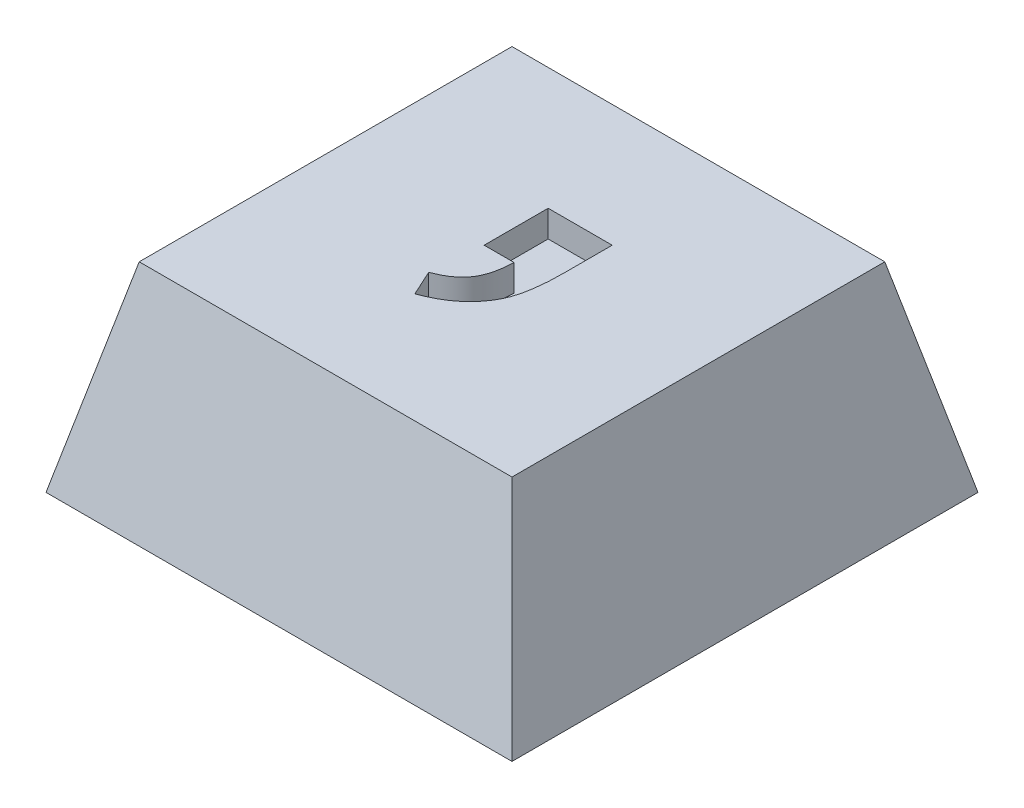
ISO-10303-21;
HEADER;
FILE_DESCRIPTION(('STEP AP214'),'2;1');
FILE_NAME('part.step','',(''),(''),'','','');
FILE_SCHEMA(('AUTOMOTIVE_DESIGN { 1 0 10303 214 1 1 1 1 }'));
ENDSEC;
DATA;
#1=APPLICATION_CONTEXT('core data for automotive mechanical design processes');
#2=APPLICATION_PROTOCOL_DEFINITION('international standard','automotive_design',2000,#1);
#3=PRODUCT_CONTEXT('',#1,'mechanical');
#4=PRODUCT('Part','Part','',(#3));
#5=PRODUCT_RELATED_PRODUCT_CATEGORY('part','',(#4));
#6=PRODUCT_DEFINITION_FORMATION('','',#4);
#7=PRODUCT_DEFINITION_CONTEXT('part definition',#1,'design');
#8=PRODUCT_DEFINITION('design','',#6,#7);
#9=PRODUCT_DEFINITION_SHAPE('','',#8);
#10=(LENGTH_UNIT() NAMED_UNIT(*) SI_UNIT(.MILLI.,.METRE.));
#11=(NAMED_UNIT(*) PLANE_ANGLE_UNIT() SI_UNIT($,.RADIAN.));
#12=(NAMED_UNIT(*) SI_UNIT($,.STERADIAN.) SOLID_ANGLE_UNIT());
#13=UNCERTAINTY_MEASURE_WITH_UNIT(LENGTH_MEASURE(1.E-05),#10,'distance_accuracy_value','');
#14=(GEOMETRIC_REPRESENTATION_CONTEXT(3) GLOBAL_UNCERTAINTY_ASSIGNED_CONTEXT((#13)) GLOBAL_UNIT_ASSIGNED_CONTEXT((#10,
#11,#12)) REPRESENTATION_CONTEXT('',''));
#15=CARTESIAN_POINT('',(0.,0.,0.));
#16=DIRECTION('',(0.,0.,1.));
#17=DIRECTION('',(1.,0.,0.));
#18=AXIS2_PLACEMENT_3D('',#15,#16,#17);
#19=CARTESIAN_POINT('',(0.,3.,0.));
#20=DIRECTION('',(0.,-1.,0.));
#21=DIRECTION('',(0.,0.,-1.));
#22=AXIS2_PLACEMENT_3D('',#19,#20,#21);
#23=PLANE('',#22);
#24=DIRECTION('',(-1.,0.,0.));
#25=VECTOR('',#24,1.);
#26=CARTESIAN_POINT('',(11.,3.,-0.7));
#27=LINE('',#26,#25);
#28=CARTESIAN_POINT('',(6.3,3.,-0.7));
#29=VERTEX_POINT('',#28);
#30=CARTESIAN_POINT('',(0.7,3.,-0.7));
#31=VERTEX_POINT('',#30);
#32=EDGE_CURVE('E65',#29,#31,#27,.T.);
#33=ORIENTED_EDGE('',*,*,#32,.F.);
#34=DIRECTION('',(0.,0.,1.));
#35=VECTOR('',#34,1.);
#36=CARTESIAN_POINT('',(6.3,3.,-7.));
#37=LINE('',#36,#35);
#38=CARTESIAN_POINT('',(6.3,3.,-6.3));
#39=VERTEX_POINT('',#38);
#40=EDGE_CURVE('E176',#39,#29,#37,.T.);
#41=ORIENTED_EDGE('',*,*,#40,.F.);
#42=DIRECTION('',(-1.,0.,0.));
#43=VECTOR('',#42,1.);
#44=CARTESIAN_POINT('',(11.,3.,-6.3));
#45=LINE('',#44,#43);
#46=CARTESIAN_POINT('',(0.699999999999998,3.,-6.3));
#47=VERTEX_POINT('',#46);
#48=EDGE_CURVE('E163',#39,#47,#45,.T.);
#49=ORIENTED_EDGE('',*,*,#48,.T.);
#50=DIRECTION('',(0.,0.,1.));
#51=VECTOR('',#50,1.);
#52=CARTESIAN_POINT('',(0.7,3.,-7.));
#53=LINE('',#52,#51);
#54=EDGE_CURVE('E177',#47,#31,#53,.T.);
#55=ORIENTED_EDGE('',*,*,#54,.T.);
#56=EDGE_LOOP('',(#33,#41,#49,#55));
#57=FACE_BOUND('',#56,.T.);
#58=DIRECTION('',(0.,0.,-1.));
#59=VECTOR('',#58,1.);
#60=CARTESIAN_POINT('',(3.07499201230395,3.,-3.50674696762963));
#61=LINE('',#60,#59);
#62=CARTESIAN_POINT('',(3.07499201230395,3.,-3.50674696762963));
#63=VERTEX_POINT('',#62);
#64=CARTESIAN_POINT('',(3.07499201230395,3.,-4.46828542916809));
#65=VERTEX_POINT('',#64);
#66=EDGE_CURVE('E58',#63,#65,#61,.T.);
#67=ORIENTED_EDGE('',*,*,#66,.T.);
#68=DIRECTION('',(1.,0.,0.));
#69=VECTOR('',#68,1.);
#70=CARTESIAN_POINT('',(3.07499201230395,3.,-4.46828542916809));
#71=LINE('',#70,#69);
#72=CARTESIAN_POINT('',(4.03653047384241,3.,-4.46828542916809));
#73=VERTEX_POINT('',#72);
#74=EDGE_CURVE('E147',#65,#73,#71,.T.);
#75=ORIENTED_EDGE('',*,*,#74,.T.);
#76=DIRECTION('',(0.,0.,1.));
#77=VECTOR('',#76,1.);
#78=CARTESIAN_POINT('',(4.03653047384241,3.,-4.46828542916809));
#79=LINE('',#78,#77);
#80=CARTESIAN_POINT('',(4.03653047384241,3.,-3.7691668394245));
#81=VERTEX_POINT('',#80);
#82=EDGE_CURVE('E434',#73,#81,#79,.T.);
#83=ORIENTED_EDGE('',*,*,#82,.T.);
#84=CARTESIAN_POINT('',(4.03653047384241,3.,-3.7691668394245));
#85=CARTESIAN_POINT('',(4.03608685146685,3.,-3.70202261305317));
#86=CARTESIAN_POINT('',(4.03524923422569,3.,-3.57524550542407));
#87=CARTESIAN_POINT('',(4.02056676372273,3.,-3.39640897964422));
#88=CARTESIAN_POINT('',(4.00016560527798,3.,-3.2393598768458));
#89=CARTESIAN_POINT('',(3.96771039123562,3.,-3.10207951934221));
#90=CARTESIAN_POINT('',(3.92425601942976,3.,-2.97810398571551));
#91=CARTESIAN_POINT('',(3.86281855154148,3.,-2.86466217175617));
#92=CARTESIAN_POINT('',(3.78726222228475,3.,-2.75610232316483));
#93=CARTESIAN_POINT('',(3.69484437591432,3.,-2.65570934866463));
#94=CARTESIAN_POINT('',(3.58853038431026,3.,-2.5628559291187));
#95=CARTESIAN_POINT('',(3.4670883338375,3.,-2.48210984664679));
#96=CARTESIAN_POINT('',(3.33340022947303,3.,-2.41016907352859));
#97=CARTESIAN_POINT('',(3.23735570534598,3.,-2.37229527644735));
#98=CARTESIAN_POINT('',(3.18817310204754,3.,-2.35290081378347));
#99=B_SPLINE_CURVE_WITH_KNOTS('',3,(#84,#85,#86,#87,#88,#89,#90,#91,#92,#93,#94,#95,#96,#97,
#98),.UNSPECIFIED.,.F.,.F.,(4,1,1,1,1,1,1,1,1,1,1,1,4),(0.,0.11226306929848,0.211967401940366,
0.29994169044828,0.376872974033872,0.447529216959618,0.518973247744178,0.591939579442453,
0.668229800220916,0.746606683184937,0.827453118097728,0.911641971053369,1.),.UNSPECIFIED.);
#100=CARTESIAN_POINT('',(3.18817310204754,3.,-2.35290081378347));
#101=VERTEX_POINT('',#100);
#102=EDGE_CURVE('E429',#81,#101,#99,.T.);
#103=ORIENTED_EDGE('',*,*,#102,.T.);
#104=DIRECTION('',(-0.418608195745654,0.,-0.908166933143113));
#105=VECTOR('',#104,1.);
#106=CARTESIAN_POINT('',(3.18817310204754,3.,-2.35290081378347));
#107=LINE('',#106,#105);
#108=CARTESIAN_POINT('',(3.01088944820138,3.,-2.73751619839886));
#109=VERTEX_POINT('',#108);
#110=EDGE_CURVE('E419',#101,#109,#107,.T.);
#111=ORIENTED_EDGE('',*,*,#110,.T.);
#112=CARTESIAN_POINT('',(3.01088944820138,3.,-2.73751619839886));
#113=CARTESIAN_POINT('',(3.05377782825176,3.,-2.75515401751433));
#114=CARTESIAN_POINT('',(3.13561584566161,3.,-2.78880985030979));
#115=CARTESIAN_POINT('',(3.24531696745308,3.,-2.85364309401779));
#116=CARTESIAN_POINT('',(3.33406253579716,3.,-2.92993599789845));
#117=CARTESIAN_POINT('',(3.40541672281135,3.,-3.01639957597613));
#118=CARTESIAN_POINT('',(3.45643151041404,3.,-3.11810713720647));
#119=CARTESIAN_POINT('',(3.49477007921536,3.,-3.23334111875122));
#120=CARTESIAN_POINT('',(3.51699424771997,3.,-3.36504918162714));
#121=CARTESIAN_POINT('',(3.52139589402638,3.,-3.45792145123487));
#122=CARTESIAN_POINT('',(3.5237099610219,3.,-3.50674696762963));
#123=B_SPLINE_CURVE_WITH_KNOTS('',3,(#112,#113,#114,#115,#116,#117,#118,#119,#120,#121,#122),
.UNSPECIFIED.,.F.,.F.,(4,1,1,1,1,1,1,1,4),(0.,0.139244977144443,0.26570210510156,
0.380936804013601,0.489358564032474,0.600190245832484,0.720743413981992,0.853187102279749,1.),.UNSPECIFIED.);
#124=CARTESIAN_POINT('',(3.5237099610219,3.,-3.50674696762963));
#125=VERTEX_POINT('',#124);
#126=EDGE_CURVE('E428',#109,#125,#123,.T.);
#127=ORIENTED_EDGE('',*,*,#126,.T.);
#128=DIRECTION('',(-1.,0.,0.));
#129=VECTOR('',#128,1.);
#130=CARTESIAN_POINT('',(3.5237099610219,3.,-3.50674696762963));
#131=LINE('',#130,#129);
#132=EDGE_CURVE('E143',#125,#63,#131,.T.);
#133=ORIENTED_EDGE('',*,*,#132,.T.);
#134=EDGE_LOOP('',(#67,#75,#83,#103,#111,#127,#133));
#135=FACE_BOUND('',#134,.T.);
#136=ADVANCED_FACE('F42',(#57,#135),#23,.F.);
#137=CARTESIAN_POINT('',(7.,0.,-7.));
#138=DIRECTION('',(-0.973841209741793,-0.227229615606418,0.));
#139=DIRECTION('',(0.227229615606418,-0.973841209741793,0.));
#140=AXIS2_PLACEMENT_3D('',#137,#138,#139);
#141=PLANE('',#140);
#142=DIRECTION('',(-0.221581128241521,0.949633406749377,-0.221581128241521));
#143=VECTOR('',#142,1.);
#144=CARTESIAN_POINT('',(6.6563126252505,1.47294589178357,-0.343687374749499));
#145=LINE('',#144,#143);
#146=CARTESIAN_POINT('',(7.,0.,0.));
#147=VERTEX_POINT('',#146);
#148=EDGE_CURVE('E173',#147,#29,#145,.T.);
#149=ORIENTED_EDGE('',*,*,#148,.F.);
#150=DIRECTION('',(0.,0.,-1.));
#151=VECTOR('',#150,1.);
#152=CARTESIAN_POINT('',(7.,0.,0.));
#153=LINE('',#152,#151);
#154=CARTESIAN_POINT('',(7.,0.,-7.));
#155=VERTEX_POINT('',#154);
#156=EDGE_CURVE('E191',#147,#155,#153,.T.);
#157=ORIENTED_EDGE('',*,*,#156,.T.);
#158=DIRECTION('',(0.221581128241521,-0.949633406749377,-0.221581128241521));
#159=VECTOR('',#158,1.);
#160=CARTESIAN_POINT('',(7.,0.,-7.));
#161=LINE('',#160,#159);
#162=EDGE_CURVE('E167',#39,#155,#161,.T.);
#163=ORIENTED_EDGE('',*,*,#162,.F.);
#164=ORIENTED_EDGE('',*,*,#40,.T.);
#165=EDGE_LOOP('',(#149,#157,#163,#164));
#166=FACE_BOUND('',#165,.T.);
#167=ADVANCED_FACE('F216',(#166),#141,.F.);
#168=CARTESIAN_POINT('',(0.,0.,-7.));
#169=DIRECTION('',(0.973841209741793,-0.227229615606418,0.));
#170=DIRECTION('',(0.227229615606418,0.973841209741793,0.));
#171=AXIS2_PLACEMENT_3D('',#168,#169,#170);
#172=PLANE('',#171);
#173=DIRECTION('',(-0.221581128241521,-0.949633406749378,0.221581128241521));
#174=VECTOR('',#173,1.);
#175=CARTESIAN_POINT('',(0.343687374749499,1.47294589178357,-0.3436873747495));
#176=LINE('',#175,#174);
#177=CARTESIAN_POINT('',(0.,0.,0.));
#178=VERTEX_POINT('',#177);
#179=EDGE_CURVE('E11',#31,#178,#176,.T.);
#180=ORIENTED_EDGE('',*,*,#179,.F.);
#181=ORIENTED_EDGE('',*,*,#54,.F.);
#182=DIRECTION('',(0.221581128241521,0.949633406749377,0.221581128241521));
#183=VECTOR('',#182,1.);
#184=CARTESIAN_POINT('',(0.,0.,-7.));
#185=LINE('',#184,#183);
#186=CARTESIAN_POINT('',(0.,0.,-7.));
#187=VERTEX_POINT('',#186);
#188=EDGE_CURVE('E51',#187,#47,#185,.T.);
#189=ORIENTED_EDGE('',*,*,#188,.F.);
#190=DIRECTION('',(0.,0.,1.));
#191=VECTOR('',#190,1.);
#192=CARTESIAN_POINT('',(0.,0.,0.));
#193=LINE('',#192,#191);
#194=EDGE_CURVE('E181',#187,#178,#193,.T.);
#195=ORIENTED_EDGE('',*,*,#194,.T.);
#196=EDGE_LOOP('',(#180,#181,#189,#195));
#197=FACE_BOUND('',#196,.T.);
#198=ADVANCED_FACE('F209',(#197),#172,.F.);
#199=CARTESIAN_POINT('',(0.,0.,0.));
#200=DIRECTION('',(0.,-1.,0.));
#201=DIRECTION('',(0.,0.,-1.));
#202=AXIS2_PLACEMENT_3D('',#199,#200,#201);
#203=PLANE('',#202);
#204=CARTESIAN_POINT('',(3.5,0.,-3.5));
#205=DIRECTION('',(0.,-1.,0.));
#206=DIRECTION('',(0.,0.,-1.));
#207=AXIS2_PLACEMENT_3D('',#204,#205,#206);
#208=CIRCLE('',#207,1.8);
#209=CARTESIAN_POINT('',(3.5,0.,-5.3));
#210=VERTEX_POINT('',#209);
#211=EDGE_CURVE('E149',#210,#210,#208,.T.);
#212=ORIENTED_EDGE('',*,*,#211,.F.);
#213=EDGE_LOOP('',(#212));
#214=FACE_BOUND('',#213,.T.);
#215=ORIENTED_EDGE('',*,*,#194,.F.);
#216=DIRECTION('',(-1.,0.,0.));
#217=VECTOR('',#216,1.);
#218=CARTESIAN_POINT('',(0.,0.,-7.));
#219=LINE('',#218,#217);
#220=EDGE_CURVE('E195',#155,#187,#219,.T.);
#221=ORIENTED_EDGE('',*,*,#220,.F.);
#222=ORIENTED_EDGE('',*,*,#156,.F.);
#223=DIRECTION('',(1.,0.,0.));
#224=VECTOR('',#223,1.);
#225=CARTESIAN_POINT('',(0.,0.,0.));
#226=LINE('',#225,#224);
#227=EDGE_CURVE('E188',#178,#147,#226,.T.);
#228=ORIENTED_EDGE('',*,*,#227,.F.);
#229=EDGE_LOOP('',(#215,#221,#222,#228));
#230=FACE_BOUND('',#229,.T.);
#231=ADVANCED_FACE('F44',(#214,#230),#203,.T.);
#232=CARTESIAN_POINT('',(11.,3.,-6.3));
#233=DIRECTION('',(0.,0.227229615606418,-0.973841209741793));
#234=DIRECTION('',(0.,0.973841209741793,0.227229615606418));
#235=AXIS2_PLACEMENT_3D('',#232,#233,#234);
#236=PLANE('',#235);
#237=ORIENTED_EDGE('',*,*,#162,.T.);
#238=ORIENTED_EDGE('',*,*,#220,.T.);
#239=ORIENTED_EDGE('',*,*,#188,.T.);
#240=ORIENTED_EDGE('',*,*,#48,.F.);
#241=EDGE_LOOP('',(#237,#238,#239,#240));
#242=FACE_BOUND('',#241,.T.);
#243=ADVANCED_FACE('F200',(#242),#236,.T.);
#244=CARTESIAN_POINT('',(11.,0.,0.));
#245=DIRECTION('',(0.,0.227229615606418,0.973841209741793));
#246=DIRECTION('',(0.,-0.973841209741793,0.227229615606418));
#247=AXIS2_PLACEMENT_3D('',#244,#245,#246);
#248=PLANE('',#247);
#249=ORIENTED_EDGE('',*,*,#148,.T.);
#250=ORIENTED_EDGE('',*,*,#32,.T.);
#251=ORIENTED_EDGE('',*,*,#179,.T.);
#252=ORIENTED_EDGE('',*,*,#227,.T.);
#253=EDGE_LOOP('',(#249,#250,#251,#252));
#254=FACE_BOUND('',#253,.T.);
#255=ADVANCED_FACE('F211',(#254),#248,.T.);
#256=CARTESIAN_POINT('',(3.5,0.8,-3.5));
#257=DIRECTION('',(0.,-1.,0.));
#258=DIRECTION('',(0.,0.,-1.));
#259=AXIS2_PLACEMENT_3D('',#256,#257,#258);
#260=CYLINDRICAL_SURFACE('',#259,1.8);
#261=CARTESIAN_POINT('',(3.5,0.8,-3.5));
#262=DIRECTION('',(0.,-1.,0.));
#263=DIRECTION('',(0.,0.,-1.));
#264=AXIS2_PLACEMENT_3D('',#261,#262,#263);
#265=CIRCLE('',#264,1.8);
#266=CARTESIAN_POINT('',(3.5,0.8,-5.3));
#267=VERTEX_POINT('',#266);
#268=EDGE_CURVE('E155',#267,#267,#265,.T.);
#269=ORIENTED_EDGE('',*,*,#268,.F.);
#270=EDGE_LOOP('',(#269));
#271=FACE_BOUND('',#270,.T.);
#272=ORIENTED_EDGE('',*,*,#211,.T.);
#273=EDGE_LOOP('',(#272));
#274=FACE_BOUND('',#273,.T.);
#275=ADVANCED_FACE('F236',(#271,#274),#260,.F.);
#276=CARTESIAN_POINT('',(3.5,0.8,-3.5));
#277=DIRECTION('',(0.,-1.,0.));
#278=DIRECTION('',(0.,0.,-1.));
#279=AXIS2_PLACEMENT_3D('',#276,#277,#278);
#280=PLANE('',#279);
#281=ORIENTED_EDGE('',*,*,#268,.T.);
#282=EDGE_LOOP('',(#281));
#283=FACE_BOUND('',#282,.T.);
#284=ADVANCED_FACE('F239',(#283),#280,.T.);
#285=CARTESIAN_POINT('',(3.07499201230395,2.6,-3.50674696762963));
#286=DIRECTION('',(1.,0.,0.));
#287=DIRECTION('',(0.,0.,-1.));
#288=AXIS2_PLACEMENT_3D('',#285,#286,#287);
#289=PLANE('',#288);
#290=ORIENTED_EDGE('',*,*,#66,.F.);
#291=DIRECTION('',(0.,1.,0.));
#292=VECTOR('',#291,1.);
#293=CARTESIAN_POINT('',(3.07499201230395,2.6,-3.50674696762963));
#294=LINE('',#293,#292);
#295=CARTESIAN_POINT('',(3.07499201230395,2.6,-3.50674696762963));
#296=VERTEX_POINT('',#295);
#297=EDGE_CURVE('E141',#296,#63,#294,.T.);
#298=ORIENTED_EDGE('',*,*,#297,.F.);
#299=DIRECTION('',(0.,0.,-1.));
#300=VECTOR('',#299,1.);
#301=CARTESIAN_POINT('',(3.07499201230395,2.6,-3.50674696762963));
#302=LINE('',#301,#300);
#303=CARTESIAN_POINT('',(3.07499201230395,2.6,-4.46828542916809));
#304=VERTEX_POINT('',#303);
#305=EDGE_CURVE('E131',#296,#304,#302,.T.);
#306=ORIENTED_EDGE('',*,*,#305,.T.);
#307=DIRECTION('',(0.,1.,0.));
#308=VECTOR('',#307,1.);
#309=CARTESIAN_POINT('',(3.07499201230395,2.6,-4.46828542916809));
#310=LINE('',#309,#308);
#311=EDGE_CURVE('E140',#304,#65,#310,.T.);
#312=ORIENTED_EDGE('',*,*,#311,.T.);
#313=EDGE_LOOP('',(#290,#298,#306,#312));
#314=FACE_BOUND('',#313,.T.);
#315=ADVANCED_FACE('F139',(#314),#289,.T.);
#316=CARTESIAN_POINT('',(3.07499201230395,2.6,-4.46828542916809));
#317=DIRECTION('',(0.,0.,1.));
#318=DIRECTION('',(1.,0.,0.));
#319=AXIS2_PLACEMENT_3D('',#316,#317,#318);
#320=PLANE('',#319);
#321=ORIENTED_EDGE('',*,*,#74,.F.);
#322=ORIENTED_EDGE('',*,*,#311,.F.);
#323=DIRECTION('',(1.,0.,0.));
#324=VECTOR('',#323,1.);
#325=CARTESIAN_POINT('',(3.07499201230395,2.6,-4.46828542916809));
#326=LINE('',#325,#324);
#327=CARTESIAN_POINT('',(4.03653047384241,2.6,-4.46828542916809));
#328=VERTEX_POINT('',#327);
#329=EDGE_CURVE('E127',#304,#328,#326,.T.);
#330=ORIENTED_EDGE('',*,*,#329,.T.);
#331=DIRECTION('',(0.,1.,0.));
#332=VECTOR('',#331,1.);
#333=CARTESIAN_POINT('',(4.03653047384241,2.6,-4.46828542916809));
#334=LINE('',#333,#332);
#335=EDGE_CURVE('E150',#328,#73,#334,.T.);
#336=ORIENTED_EDGE('',*,*,#335,.T.);
#337=EDGE_LOOP('',(#321,#322,#330,#336));
#338=FACE_BOUND('',#337,.T.);
#339=ADVANCED_FACE('F145',(#338),#320,.T.);
#340=CARTESIAN_POINT('',(4.03653047384241,2.6,-4.46828542916809));
#341=DIRECTION('',(-1.,0.,0.));
#342=DIRECTION('',(0.,0.,1.));
#343=AXIS2_PLACEMENT_3D('',#340,#341,#342);
#344=PLANE('',#343);
#345=ORIENTED_EDGE('',*,*,#82,.F.);
#346=ORIENTED_EDGE('',*,*,#335,.F.);
#347=DIRECTION('',(0.,0.,1.));
#348=VECTOR('',#347,1.);
#349=CARTESIAN_POINT('',(4.03653047384241,2.6,-4.46828542916809));
#350=LINE('',#349,#348);
#351=CARTESIAN_POINT('',(4.03653047384241,2.6,-3.7691668394245));
#352=VERTEX_POINT('',#351);
#353=EDGE_CURVE('E133',#328,#352,#350,.T.);
#354=ORIENTED_EDGE('',*,*,#353,.T.);
#355=DIRECTION('',(0.,1.,0.));
#356=VECTOR('',#355,1.);
#357=CARTESIAN_POINT('',(4.03653047384241,2.6,-3.7691668394245));
#358=LINE('',#357,#356);
#359=EDGE_CURVE('E157',#352,#81,#358,.T.);
#360=ORIENTED_EDGE('',*,*,#359,.T.);
#361=EDGE_LOOP('',(#345,#346,#354,#360));
#362=FACE_BOUND('',#361,.T.);
#363=ADVANCED_FACE('F248',(#362),#344,.T.);
#364=CARTESIAN_POINT('',(4.03653047384241,2.6,-3.7691668394245));
#365=CARTESIAN_POINT('',(4.03608685146685,2.6,-3.70202261305317));
#366=CARTESIAN_POINT('',(4.03524923422569,2.6,-3.57524550542407));
#367=CARTESIAN_POINT('',(4.02056676372273,2.6,-3.39640897964422));
#368=CARTESIAN_POINT('',(4.00016560527798,2.6,-3.2393598768458));
#369=CARTESIAN_POINT('',(3.96771039123562,2.6,-3.10207951934221));
#370=CARTESIAN_POINT('',(3.92425601942976,2.6,-2.97810398571551));
#371=CARTESIAN_POINT('',(3.86281855154148,2.6,-2.86466217175617));
#372=CARTESIAN_POINT('',(3.78726222228475,2.6,-2.75610232316483));
#373=CARTESIAN_POINT('',(3.69484437591432,2.6,-2.65570934866463));
#374=CARTESIAN_POINT('',(3.58853038431026,2.6,-2.5628559291187));
#375=CARTESIAN_POINT('',(3.4670883338375,2.6,-2.48210984664679));
#376=CARTESIAN_POINT('',(3.33340022947303,2.6,-2.41016907352859));
#377=CARTESIAN_POINT('',(3.23735570534598,2.6,-2.37229527644735));
#378=CARTESIAN_POINT('',(3.18817310204754,2.6,-2.35290081378347));
#379=B_SPLINE_CURVE_WITH_KNOTS('',3,(#364,#365,#366,#367,#368,#369,#370,#371,#372,#373,#374,
#375,#376,#377,#378),.UNSPECIFIED.,.F.,.F.,(4,1,1,1,1,1,1,1,1,1,1,1,4),(0.,0.11226306929848,
0.211967401940366,0.29994169044828,0.376872974033872,0.447529216959618,0.518973247744178,
0.591939579442453,0.668229800220916,0.746606683184937,0.827453118097728,0.911641971053369,1.),.UNSPECIFIED.);
#380=DIRECTION('',(0.,1.,0.));
#381=VECTOR('',#380,1.);
#382=SURFACE_OF_LINEAR_EXTRUSION('',#379,#381);
#383=ORIENTED_EDGE('',*,*,#102,.F.);
#384=ORIENTED_EDGE('',*,*,#359,.F.);
#385=CARTESIAN_POINT('',(3.18817310204754,2.6,-2.35290081378347));
#386=VERTEX_POINT('',#385);
#387=EDGE_CURVE('E259',#352,#386,#379,.T.);
#388=ORIENTED_EDGE('',*,*,#387,.T.);
#389=DIRECTION('',(0.,1.,0.));
#390=VECTOR('',#389,1.);
#391=CARTESIAN_POINT('',(3.18817310204754,2.6,-2.35290081378347));
#392=LINE('',#391,#390);
#393=EDGE_CURVE('E421',#386,#101,#392,.T.);
#394=ORIENTED_EDGE('',*,*,#393,.T.);
#395=EDGE_LOOP('',(#383,#384,#388,#394));
#396=FACE_BOUND('',#395,.T.);
#397=ADVANCED_FACE('F251',(#396),#382,.T.);
#398=CARTESIAN_POINT('',(3.18817310204754,2.6,-2.35290081378347));
#399=DIRECTION('',(0.908166933143113,0.,-0.418608195745654));
#400=DIRECTION('',(-0.418608195745654,0.,-0.908166933143113));
#401=AXIS2_PLACEMENT_3D('',#398,#399,#400);
#402=PLANE('',#401);
#403=ORIENTED_EDGE('',*,*,#110,.F.);
#404=ORIENTED_EDGE('',*,*,#393,.F.);
#405=DIRECTION('',(-0.418608195745654,0.,-0.908166933143113));
#406=VECTOR('',#405,1.);
#407=CARTESIAN_POINT('',(3.18817310204754,2.6,-2.35290081378347));
#408=LINE('',#407,#406);
#409=CARTESIAN_POINT('',(3.01088944820138,2.6,-2.73751619839886));
#410=VERTEX_POINT('',#409);
#411=EDGE_CURVE('E266',#386,#410,#408,.T.);
#412=ORIENTED_EDGE('',*,*,#411,.T.);
#413=DIRECTION('',(0.,1.,0.));
#414=VECTOR('',#413,1.);
#415=CARTESIAN_POINT('',(3.01088944820138,2.6,-2.73751619839886));
#416=LINE('',#415,#414);
#417=EDGE_CURVE('E424',#410,#109,#416,.T.);
#418=ORIENTED_EDGE('',*,*,#417,.T.);
#419=EDGE_LOOP('',(#403,#404,#412,#418));
#420=FACE_BOUND('',#419,.T.);
#421=ADVANCED_FACE('F256',(#420),#402,.T.);
#422=CARTESIAN_POINT('',(3.01088944820138,2.6,-2.73751619839886));
#423=CARTESIAN_POINT('',(3.05377782825176,2.6,-2.75515401751433));
#424=CARTESIAN_POINT('',(3.13561584566161,2.6,-2.78880985030979));
#425=CARTESIAN_POINT('',(3.24531696745308,2.6,-2.85364309401779));
#426=CARTESIAN_POINT('',(3.33406253579716,2.6,-2.92993599789845));
#427=CARTESIAN_POINT('',(3.40541672281135,2.6,-3.01639957597613));
#428=CARTESIAN_POINT('',(3.45643151041404,2.6,-3.11810713720647));
#429=CARTESIAN_POINT('',(3.49477007921536,2.6,-3.23334111875122));
#430=CARTESIAN_POINT('',(3.51699424771997,2.6,-3.36504918162714));
#431=CARTESIAN_POINT('',(3.52139589402638,2.6,-3.45792145123487));
#432=CARTESIAN_POINT('',(3.5237099610219,2.6,-3.50674696762963));
#433=B_SPLINE_CURVE_WITH_KNOTS('',3,(#422,#423,#424,#425,#426,#427,#428,#429,#430,#431,#432),
.UNSPECIFIED.,.F.,.F.,(4,1,1,1,1,1,1,1,4),(0.,0.139244977144443,0.26570210510156,
0.380936804013601,0.489358564032474,0.600190245832484,0.720743413981992,0.853187102279749,1.),.UNSPECIFIED.);
#434=DIRECTION('',(0.,1.,0.));
#435=VECTOR('',#434,1.);
#436=SURFACE_OF_LINEAR_EXTRUSION('',#433,#435);
#437=ORIENTED_EDGE('',*,*,#126,.F.);
#438=ORIENTED_EDGE('',*,*,#417,.F.);
#439=CARTESIAN_POINT('',(3.5237099610219,2.6,-3.50674696762963));
#440=VERTEX_POINT('',#439);
#441=EDGE_CURVE('E272',#410,#440,#433,.T.);
#442=ORIENTED_EDGE('',*,*,#441,.T.);
#443=DIRECTION('',(0.,1.,0.));
#444=VECTOR('',#443,1.);
#445=CARTESIAN_POINT('',(3.5237099610219,2.6,-3.50674696762963));
#446=LINE('',#445,#444);
#447=EDGE_CURVE('E459',#440,#125,#446,.T.);
#448=ORIENTED_EDGE('',*,*,#447,.T.);
#449=EDGE_LOOP('',(#437,#438,#442,#448));
#450=FACE_BOUND('',#449,.T.);
#451=ADVANCED_FACE('F283',(#450),#436,.T.);
#452=CARTESIAN_POINT('',(3.5237099610219,2.6,-3.50674696762963));
#453=DIRECTION('',(0.,0.,-1.));
#454=DIRECTION('',(-1.,0.,0.));
#455=AXIS2_PLACEMENT_3D('',#452,#453,#454);
#456=PLANE('',#455);
#457=ORIENTED_EDGE('',*,*,#132,.F.);
#458=ORIENTED_EDGE('',*,*,#447,.F.);
#459=DIRECTION('',(-1.,0.,0.));
#460=VECTOR('',#459,1.);
#461=CARTESIAN_POINT('',(3.5237099610219,2.6,-3.50674696762963));
#462=LINE('',#461,#460);
#463=EDGE_CURVE('E278',#440,#296,#462,.T.);
#464=ORIENTED_EDGE('',*,*,#463,.T.);
#465=ORIENTED_EDGE('',*,*,#297,.T.);
#466=EDGE_LOOP('',(#457,#458,#464,#465));
#467=FACE_BOUND('',#466,.T.);
#468=ADVANCED_FACE('F286',(#467),#456,.T.);
#469=CARTESIAN_POINT('',(3.87866117261295,2.6,-2.89601296529038));
#470=DIRECTION('',(-1.14085817799456E-13,1.,0.));
#471=DIRECTION('',(-1.,-1.14085817799456E-13,0.));
#472=AXIS2_PLACEMENT_3D('',#469,#470,#471);
#473=PLANE('',#472);
#474=ORIENTED_EDGE('',*,*,#305,.F.);
#475=ORIENTED_EDGE('',*,*,#463,.F.);
#476=ORIENTED_EDGE('',*,*,#441,.F.);
#477=ORIENTED_EDGE('',*,*,#411,.F.);
#478=ORIENTED_EDGE('',*,*,#387,.F.);
#479=ORIENTED_EDGE('',*,*,#353,.F.);
#480=ORIENTED_EDGE('',*,*,#329,.F.);
#481=EDGE_LOOP('',(#474,#475,#476,#477,#478,#479,#480));
#482=FACE_BOUND('',#481,.T.);
#483=ADVANCED_FACE('F129',(#482),#473,.T.);
#484=CLOSED_SHELL('',(#136,#167,#198,#231,#243,#255,#275,#284,#315,#339,#363,#397,#421,#451,
#468,#483));
#485=MANIFOLD_SOLID_BREP('B2',#484);
#486=ADVANCED_BREP_SHAPE_REPRESENTATION('',(#18,#485),#14);
#487=SHAPE_DEFINITION_REPRESENTATION(#9,#486);
ENDSEC;
END-ISO-10303-21;
